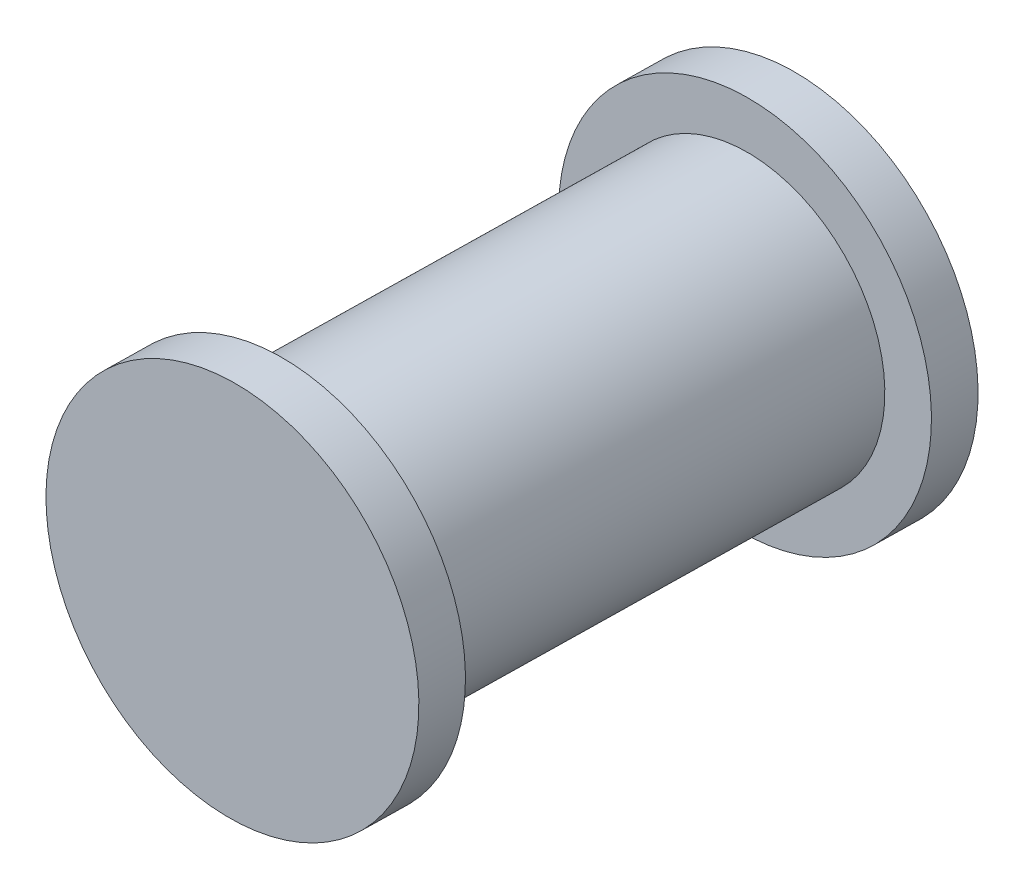
ISO-10303-21;
HEADER;
FILE_DESCRIPTION(('STEP AP214'),'2;1');
FILE_NAME('part.step','',(''),(''),'','','');
FILE_SCHEMA(('AUTOMOTIVE_DESIGN { 1 0 10303 214 1 1 1 1 }'));
ENDSEC;
DATA;
#1=APPLICATION_CONTEXT('core data for automotive mechanical design processes');
#2=APPLICATION_PROTOCOL_DEFINITION('international standard','automotive_design',2000,#1);
#3=PRODUCT_CONTEXT('',#1,'mechanical');
#4=PRODUCT('Part','Part','',(#3));
#5=PRODUCT_RELATED_PRODUCT_CATEGORY('part','',(#4));
#6=PRODUCT_DEFINITION_FORMATION('','',#4);
#7=PRODUCT_DEFINITION_CONTEXT('part definition',#1,'design');
#8=PRODUCT_DEFINITION('design','',#6,#7);
#9=PRODUCT_DEFINITION_SHAPE('','',#8);
#10=(LENGTH_UNIT() NAMED_UNIT(*) SI_UNIT(.MILLI.,.METRE.));
#11=(NAMED_UNIT(*) PLANE_ANGLE_UNIT() SI_UNIT($,.RADIAN.));
#12=(NAMED_UNIT(*) SI_UNIT($,.STERADIAN.) SOLID_ANGLE_UNIT());
#13=UNCERTAINTY_MEASURE_WITH_UNIT(LENGTH_MEASURE(1.E-05),#10,'distance_accuracy_value','');
#14=(GEOMETRIC_REPRESENTATION_CONTEXT(3) GLOBAL_UNCERTAINTY_ASSIGNED_CONTEXT((#13)) GLOBAL_UNIT_ASSIGNED_CONTEXT((#10,
#11,#12)) REPRESENTATION_CONTEXT('',''));
#15=CARTESIAN_POINT('',(0.,0.,0.));
#16=DIRECTION('',(0.,0.,1.));
#17=DIRECTION('',(1.,0.,0.));
#18=AXIS2_PLACEMENT_3D('',#15,#16,#17);
#19=CARTESIAN_POINT('',(-3.31646168860722E-12,2.87844237431514,-6.92912424034663));
#20=DIRECTION('',(4.78159178918247E-13,0.0174524064370392,0.999847695156396));
#21=DIRECTION('',(1.,0.,-4.78200812281671E-13));
#22=AXIS2_PLACEMENT_3D('',#19,#20,#21);
#23=PLANE('',#22);
#24=CARTESIAN_POINT('',(-3.34985945232846E-12,6.87783315494072,-6.99893386609478));
#25=DIRECTION('',(-4.78159178918247E-13,-0.0174524064370392,-0.999847695156396));
#26=DIRECTION('',(-1.,0.,4.78200812281671E-13));
#27=AXIS2_PLACEMENT_3D('',#24,#25,#26);
#28=CIRCLE('',#27,4.);
#29=CARTESIAN_POINT('',(-4.00000000000335,6.87783315494072,-6.99893386609287));
#30=VERTEX_POINT('',#29);
#31=EDGE_CURVE('E53',#30,#30,#28,.T.);
#32=ORIENTED_EDGE('',*,*,#31,.T.);
#33=EDGE_LOOP('',(#32));
#34=FACE_BOUND('',#33,.T.);
#35=ADVANCED_FACE('F31',(#34),#23,.F.);
#36=CARTESIAN_POINT('',(2.3880506946905E-12,7.08726203218519,4.99923847578196));
#37=DIRECTION('',(-4.78159178918247E-13,-0.0174524064370392,-0.999847695156396));
#38=DIRECTION('',(-1.,0.,4.78200812281671E-13));
#39=AXIS2_PLACEMENT_3D('',#36,#37,#38);
#40=PLANE('',#39);
#41=CARTESIAN_POINT('',(2.3880506946905E-12,7.08726203218519,4.99923847578197));
#42=DIRECTION('',(-4.78159178918247E-13,-0.0174524064370392,-0.999847695156396));
#43=DIRECTION('',(-1.,0.,4.78200812281671E-13));
#44=AXIS2_PLACEMENT_3D('',#41,#42,#43);
#45=CIRCLE('',#44,4.);
#46=CARTESIAN_POINT('',(-3.99999999999761,7.08726203218519,4.99923847578388));
#47=VERTEX_POINT('',#46);
#48=EDGE_CURVE('E10',#47,#47,#45,.T.);
#49=ORIENTED_EDGE('',*,*,#48,.F.);
#50=EDGE_LOOP('',(#49));
#51=FACE_BOUND('',#50,.T.);
#52=ADVANCED_FACE('F83',(#51),#40,.F.);
#53=CARTESIAN_POINT('',(-3.34985945232846E-12,6.87783315494072,-6.99893386609478));
#54=DIRECTION('',(-4.78159178918247E-13,-0.0174524064370392,-0.999847695156396));
#55=DIRECTION('',(-1.,0.,4.78200812281671E-13));
#56=AXIS2_PLACEMENT_3D('',#53,#54,#55);
#57=CYLINDRICAL_SURFACE('',#56,4.);
#58=CARTESIAN_POINT('',(1.90989151577226E-12,7.06980962574815,3.99939078062557));
#59=DIRECTION('',(-4.78159178918247E-13,-0.0174524064370392,-0.999847695156396));
#60=DIRECTION('',(-1.,0.,4.78200812281671E-13));
#61=AXIS2_PLACEMENT_3D('',#58,#59,#60);
#62=CIRCLE('',#61,4.);
#63=CARTESIAN_POINT('',(-3.99999999999809,7.06980962574815,3.99939078062748));
#64=VERTEX_POINT('',#63);
#65=EDGE_CURVE('E37',#64,#64,#62,.T.);
#66=ORIENTED_EDGE('',*,*,#65,.F.);
#67=EDGE_LOOP('',(#66));
#68=FACE_BOUND('',#67,.T.);
#69=ORIENTED_EDGE('',*,*,#48,.T.);
#70=EDGE_LOOP('',(#69));
#71=FACE_BOUND('',#70,.T.);
#72=ADVANCED_FACE('F78',(#68,#71),#57,.T.);
#73=CARTESIAN_POINT('',(1.9432892794935E-12,3.07041884512257,4.06920040637373));
#74=DIRECTION('',(4.78159178918247E-13,0.0174524064370392,0.999847695156396));
#75=DIRECTION('',(1.,0.,-4.78200812281671E-13));
#76=AXIS2_PLACEMENT_3D('',#73,#74,#75);
#77=PLANE('',#76);
#78=CARTESIAN_POINT('',(1.90989151577226E-12,7.06980962574815,3.99939078062557));
#79=DIRECTION('',(-4.78159178918247E-13,-0.0174524064370392,-0.999847695156396));
#80=DIRECTION('',(-1.,0.,4.78200812281671E-13));
#81=AXIS2_PLACEMENT_3D('',#78,#79,#80);
#82=CIRCLE('',#81,3.);
#83=CARTESIAN_POINT('',(-2.99999999999809,7.06980962574815,3.99939078062701));
#84=VERTEX_POINT('',#83);
#85=EDGE_CURVE('E41',#84,#84,#82,.T.);
#86=ORIENTED_EDGE('',*,*,#85,.F.);
#87=EDGE_LOOP('',(#86));
#88=FACE_BOUND('',#87,.T.);
#89=ORIENTED_EDGE('',*,*,#65,.T.);
#90=EDGE_LOOP('',(#89));
#91=FACE_BOUND('',#90,.T.);
#92=ADVANCED_FACE('F73',(#88,#91),#77,.F.);
#93=CARTESIAN_POINT('',(-3.34985945232846E-12,6.87783315494072,-6.99893386609478));
#94=DIRECTION('',(-4.78159178918247E-13,-0.0174524064370392,-0.999847695156396));
#95=DIRECTION('',(-1.,0.,4.78200812281671E-13));
#96=AXIS2_PLACEMENT_3D('',#93,#94,#95);
#97=CYLINDRICAL_SURFACE('',#96,3.);
#98=CARTESIAN_POINT('',(-2.87170027341022E-12,6.89528556137776,-5.99908617093839));
#99=DIRECTION('',(-4.78159178918247E-13,-0.0174524064370392,-0.999847695156396));
#100=DIRECTION('',(-1.,0.,4.78200812281671E-13));
#101=AXIS2_PLACEMENT_3D('',#98,#99,#100);
#102=CIRCLE('',#101,3.);
#103=CARTESIAN_POINT('',(-3.00000000000287,6.89528556137776,-5.99908617093695));
#104=VERTEX_POINT('',#103);
#105=EDGE_CURVE('E45',#104,#104,#102,.T.);
#106=ORIENTED_EDGE('',*,*,#105,.F.);
#107=EDGE_LOOP('',(#106));
#108=FACE_BOUND('',#107,.T.);
#109=ORIENTED_EDGE('',*,*,#85,.T.);
#110=EDGE_LOOP('',(#109));
#111=FACE_BOUND('',#110,.T.);
#112=ADVANCED_FACE('F67',(#108,#111),#97,.T.);
#113=CARTESIAN_POINT('',(-2.84665195061928E-12,3.89574247590858,-5.94672895162727));
#114=DIRECTION('',(-4.78159178918247E-13,-0.0174524064370392,-0.999847695156396));
#115=DIRECTION('',(-1.,0.,4.78200812281671E-13));
#116=AXIS2_PLACEMENT_3D('',#113,#114,#115);
#117=PLANE('',#116);
#118=CARTESIAN_POINT('',(-2.87170027341022E-12,6.89528556137776,-5.99908617093839));
#119=DIRECTION('',(-4.78159178918247E-13,-0.0174524064370392,-0.999847695156396));
#120=DIRECTION('',(-1.,0.,4.78200812281671E-13));
#121=AXIS2_PLACEMENT_3D('',#118,#119,#120);
#122=CIRCLE('',#121,4.);
#123=CARTESIAN_POINT('',(-4.00000000000287,6.89528556137776,-5.99908617093647));
#124=VERTEX_POINT('',#123);
#125=EDGE_CURVE('E50',#124,#124,#122,.T.);
#126=ORIENTED_EDGE('',*,*,#125,.F.);
#127=EDGE_LOOP('',(#126));
#128=FACE_BOUND('',#127,.T.);
#129=ORIENTED_EDGE('',*,*,#105,.T.);
#130=EDGE_LOOP('',(#129));
#131=FACE_BOUND('',#130,.T.);
#132=ADVANCED_FACE('F61',(#128,#131),#117,.F.);
#133=CARTESIAN_POINT('',(-3.34985945232846E-12,6.87783315494072,-6.99893386609478));
#134=DIRECTION('',(-4.78159178918247E-13,-0.0174524064370392,-0.999847695156396));
#135=DIRECTION('',(-1.,0.,4.78200812281671E-13));
#136=AXIS2_PLACEMENT_3D('',#133,#134,#135);
#137=CYLINDRICAL_SURFACE('',#136,4.);
#138=ORIENTED_EDGE('',*,*,#31,.F.);
#139=EDGE_LOOP('',(#138));
#140=FACE_BOUND('',#139,.T.);
#141=ORIENTED_EDGE('',*,*,#125,.T.);
#142=EDGE_LOOP('',(#141));
#143=FACE_BOUND('',#142,.T.);
#144=ADVANCED_FACE('F58',(#140,#143),#137,.T.);
#145=CLOSED_SHELL('',(#35,#52,#72,#92,#112,#132,#144));
#146=MANIFOLD_SOLID_BREP('B2',#145);
#147=ADVANCED_BREP_SHAPE_REPRESENTATION('',(#18,#146),#14);
#148=SHAPE_DEFINITION_REPRESENTATION(#9,#147);
ENDSEC;
END-ISO-10303-21;
